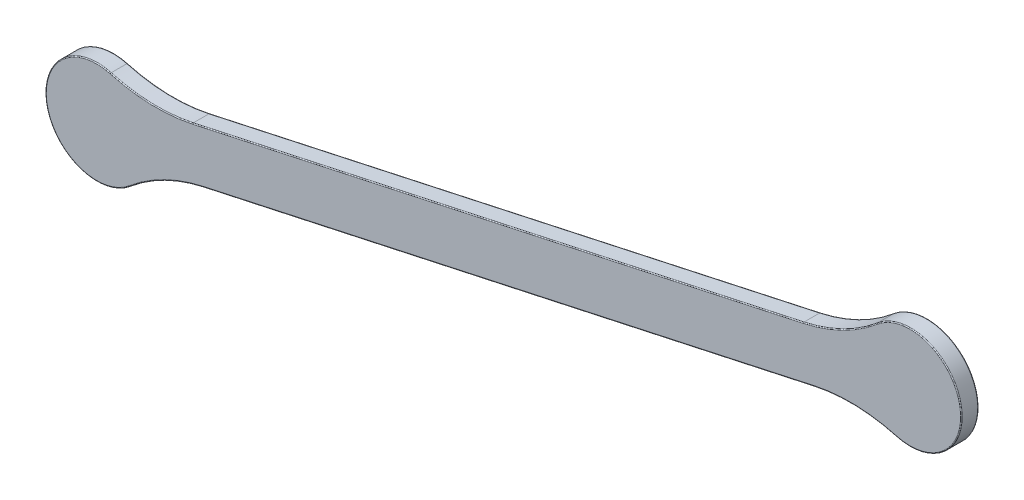
ISO-10303-21;
HEADER;
FILE_DESCRIPTION(('STEP AP214'),'2;1');
FILE_NAME('part.step','',(''),(''),'','','');
FILE_SCHEMA(('AUTOMOTIVE_DESIGN { 1 0 10303 214 1 1 1 1 }'));
ENDSEC;
DATA;
#1=APPLICATION_CONTEXT('core data for automotive mechanical design processes');
#2=APPLICATION_PROTOCOL_DEFINITION('international standard','automotive_design',2000,#1);
#3=PRODUCT_CONTEXT('',#1,'mechanical');
#4=PRODUCT('Part','Part','',(#3));
#5=PRODUCT_RELATED_PRODUCT_CATEGORY('part','',(#4));
#6=PRODUCT_DEFINITION_FORMATION('','',#4);
#7=PRODUCT_DEFINITION_CONTEXT('part definition',#1,'design');
#8=PRODUCT_DEFINITION('design','',#6,#7);
#9=PRODUCT_DEFINITION_SHAPE('','',#8);
#10=(LENGTH_UNIT() NAMED_UNIT(*) SI_UNIT(.MILLI.,.METRE.));
#11=(NAMED_UNIT(*) PLANE_ANGLE_UNIT() SI_UNIT($,.RADIAN.));
#12=(NAMED_UNIT(*) SI_UNIT($,.STERADIAN.) SOLID_ANGLE_UNIT());
#13=UNCERTAINTY_MEASURE_WITH_UNIT(LENGTH_MEASURE(1.E-05),#10,'distance_accuracy_value','');
#14=(GEOMETRIC_REPRESENTATION_CONTEXT(3) GLOBAL_UNCERTAINTY_ASSIGNED_CONTEXT((#13)) GLOBAL_UNIT_ASSIGNED_CONTEXT((#10,
#11,#12)) REPRESENTATION_CONTEXT('',''));
#15=CARTESIAN_POINT('',(0.,0.,0.));
#16=DIRECTION('',(0.,0.,1.));
#17=DIRECTION('',(1.,0.,0.));
#18=AXIS2_PLACEMENT_3D('',#15,#16,#17);
#19=CARTESIAN_POINT('',(-101.472478495042,222.230200700582,-3.));
#20=DIRECTION('',(0.,0.,1.));
#21=DIRECTION('',(1.,0.,0.));
#22=AXIS2_PLACEMENT_3D('',#19,#20,#21);
#23=CYLINDRICAL_SURFACE('',#22,9.);
#24=DIRECTION('',(0.,0.,1.));
#25=VECTOR('',#24,1.);
#26=CARTESIAN_POINT('',(-107.26569867696,229.117769206507,-3.));
#27=LINE('',#26,#25);
#28=CARTESIAN_POINT('',(-107.26569867696,229.117769206507,-2.85));
#29=VERTEX_POINT('',#28);
#30=CARTESIAN_POINT('',(-107.26569867696,229.117769206507,-0.15));
#31=VERTEX_POINT('',#30);
#32=EDGE_CURVE('E284',#29,#31,#27,.T.);
#33=ORIENTED_EDGE('',*,*,#32,.T.);
#34=CARTESIAN_POINT('',(-101.472478495042,222.230200700582,-0.15));
#35=DIRECTION('',(0.,0.,1.));
#36=DIRECTION('',(1.,0.,0.));
#37=AXIS2_PLACEMENT_3D('',#34,#35,#36);
#38=CIRCLE('',#37,9.);
#39=CARTESIAN_POINT('',(-103.881246361037,213.558532039491,-0.15));
#40=VERTEX_POINT('',#39);
#41=EDGE_CURVE('E201',#31,#40,#38,.F.);
#42=ORIENTED_EDGE('',*,*,#41,.T.);
#43=DIRECTION('',(0.,0.,1.));
#44=VECTOR('',#43,1.);
#45=CARTESIAN_POINT('',(-103.881246361037,213.558532039491,-3.));
#46=LINE('',#45,#44);
#47=CARTESIAN_POINT('',(-103.881246361037,213.558532039491,-2.85));
#48=VERTEX_POINT('',#47);
#49=EDGE_CURVE('E168',#40,#48,#46,.F.);
#50=ORIENTED_EDGE('',*,*,#49,.T.);
#51=CARTESIAN_POINT('',(-101.472478495042,222.230200700582,-2.85));
#52=DIRECTION('',(0.,0.,1.));
#53=DIRECTION('',(1.,0.,0.));
#54=AXIS2_PLACEMENT_3D('',#51,#52,#53);
#55=CIRCLE('',#54,9.);
#56=EDGE_CURVE('E199',#48,#29,#55,.T.);
#57=ORIENTED_EDGE('',*,*,#56,.T.);
#58=EDGE_LOOP('',(#33,#42,#50,#57));
#59=FACE_BOUND('',#58,.T.);
#60=ADVANCED_FACE('F35',(#59),#23,.T.);
#61=CARTESIAN_POINT('',(-49.7835516657889,228.868370737603,-3.));
#62=DIRECTION('',(-0.212550145444446,0.977150160247413,0.));
#63=DIRECTION('',(-0.977150160247413,-0.212550145444446,0.));
#64=AXIS2_PLACEMENT_3D('',#61,#62,#63);
#65=PLANE('',#64);
#66=DIRECTION('',(0.,0.,1.));
#67=VECTOR('',#66,1.);
#68=CARTESIAN_POINT('',(-118.286976944354,213.967474643276,-3.));
#69=LINE('',#68,#67);
#70=CARTESIAN_POINT('',(-118.286976944354,213.967474643276,-2.85));
#71=VERTEX_POINT('',#70);
#72=CARTESIAN_POINT('',(-118.286976944354,213.967474643276,-0.15));
#73=VERTEX_POINT('',#72);
#74=EDGE_CURVE('E285',#71,#73,#69,.T.);
#75=ORIENTED_EDGE('',*,*,#74,.T.);
#76=DIRECTION('',(-0.977150160247413,-0.212550145444446,0.));
#77=VECTOR('',#76,1.);
#78=CARTESIAN_POINT('',(-225.408952132852,190.666254080772,-0.15));
#79=LINE('',#78,#77);
#80=CARTESIAN_POINT('',(-225.408952132852,190.666254080772,-0.15));
#81=VERTEX_POINT('',#80);
#82=EDGE_CURVE('E209',#73,#81,#79,.T.);
#83=ORIENTED_EDGE('',*,*,#82,.T.);
#84=DIRECTION('',(0.,0.,1.));
#85=VECTOR('',#84,1.);
#86=CARTESIAN_POINT('',(-225.408952132852,190.666254080772,-3.));
#87=LINE('',#86,#85);
#88=CARTESIAN_POINT('',(-225.408952132852,190.666254080772,-2.85));
#89=VERTEX_POINT('',#88);
#90=EDGE_CURVE('E277',#81,#89,#87,.F.);
#91=ORIENTED_EDGE('',*,*,#90,.T.);
#92=DIRECTION('',(-0.977150160247413,-0.212550145444446,0.));
#93=VECTOR('',#92,1.);
#94=CARTESIAN_POINT('',(-49.7835516657889,228.868370737603,-2.85));
#95=LINE('',#94,#93);
#96=EDGE_CURVE('E207',#89,#71,#95,.F.);
#97=ORIENTED_EDGE('',*,*,#96,.T.);
#98=EDGE_LOOP('',(#75,#83,#91,#97));
#99=FACE_BOUND('',#98,.T.);
#100=ADVANCED_FACE('F282',(#99),#65,.F.);
#101=CARTESIAN_POINT('',(-244.136401891164,191.197879465693,-3.));
#102=DIRECTION('',(0.,0.,1.));
#103=DIRECTION('',(1.,0.,0.));
#104=AXIS2_PLACEMENT_3D('',#101,#102,#103);
#105=CYLINDRICAL_SURFACE('',#104,8.99999999999999);
#106=DIRECTION('',(0.,0.,1.));
#107=VECTOR('',#106,1.);
#108=CARTESIAN_POINT('',(-238.343181709246,184.310310959767,-3.));
#109=LINE('',#108,#107);
#110=CARTESIAN_POINT('',(-238.343181709246,184.310310959767,-2.85));
#111=VERTEX_POINT('',#110);
#112=CARTESIAN_POINT('',(-238.343181709246,184.310310959767,-0.15));
#113=VERTEX_POINT('',#112);
#114=EDGE_CURVE('E279',#111,#113,#109,.T.);
#115=ORIENTED_EDGE('',*,*,#114,.T.);
#116=CARTESIAN_POINT('',(-244.136401891164,191.197879465693,-0.15));
#117=DIRECTION('',(0.,0.,1.));
#118=DIRECTION('',(1.,0.,0.));
#119=AXIS2_PLACEMENT_3D('',#116,#117,#118);
#120=CIRCLE('',#119,8.99999999999999);
#121=CARTESIAN_POINT('',(-241.727634025169,199.869548126784,-0.15));
#122=VERTEX_POINT('',#121);
#123=EDGE_CURVE('E184',#113,#122,#120,.F.);
#124=ORIENTED_EDGE('',*,*,#123,.T.);
#125=DIRECTION('',(0.,0.,1.));
#126=VECTOR('',#125,1.);
#127=CARTESIAN_POINT('',(-241.727634025169,199.869548126784,-3.));
#128=LINE('',#127,#126);
#129=CARTESIAN_POINT('',(-241.727634025169,199.869548126784,-2.85));
#130=VERTEX_POINT('',#129);
#131=EDGE_CURVE('E289',#122,#130,#128,.F.);
#132=ORIENTED_EDGE('',*,*,#131,.T.);
#133=CARTESIAN_POINT('',(-244.136401891164,191.197879465693,-2.85));
#134=DIRECTION('',(0.,0.,1.));
#135=DIRECTION('',(1.,0.,0.));
#136=AXIS2_PLACEMENT_3D('',#133,#134,#135);
#137=CIRCLE('',#136,8.99999999999999);
#138=EDGE_CURVE('E182',#130,#111,#137,.T.);
#139=ORIENTED_EDGE('',*,*,#138,.T.);
#140=EDGE_LOOP('',(#115,#124,#132,#139));
#141=FACE_BOUND('',#140,.T.);
#142=ADVANCED_FACE('F314',(#141),#105,.T.);
#143=CARTESIAN_POINT('',(-51.6965029747889,237.66272217983,-3.));
#144=DIRECTION('',(-0.212550145444446,0.977150160247413,0.));
#145=DIRECTION('',(-0.977150160247413,-0.212550145444446,0.));
#146=AXIS2_PLACEMENT_3D('',#143,#144,#145);
#147=PLANE('',#146);
#148=DIRECTION('',(0.,0.,-1.));
#149=VECTOR('',#148,1.);
#150=CARTESIAN_POINT('',(-227.321903441852,199.460605522998,0.));
#151=LINE('',#150,#149);
#152=CARTESIAN_POINT('',(-227.321903441852,199.460605522998,-2.85));
#153=VERTEX_POINT('',#152);
#154=CARTESIAN_POINT('',(-227.321903441852,199.460605522998,-0.15));
#155=VERTEX_POINT('',#154);
#156=EDGE_CURVE('E315',#153,#155,#151,.F.);
#157=ORIENTED_EDGE('',*,*,#156,.T.);
#158=DIRECTION('',(-0.977150160247413,-0.212550145444446,0.));
#159=VECTOR('',#158,1.);
#160=CARTESIAN_POINT('',(-51.6965029747889,237.66272217983,-0.15));
#161=LINE('',#160,#159);
#162=CARTESIAN_POINT('',(-120.199928253354,222.761826085503,-0.15));
#163=VERTEX_POINT('',#162);
#164=EDGE_CURVE('E192',#155,#163,#161,.F.);
#165=ORIENTED_EDGE('',*,*,#164,.T.);
#166=DIRECTION('',(0.,0.,-1.));
#167=VECTOR('',#166,1.);
#168=CARTESIAN_POINT('',(-120.199928253354,222.761826085503,-3.));
#169=LINE('',#168,#167);
#170=CARTESIAN_POINT('',(-120.199928253354,222.761826085503,-2.85));
#171=VERTEX_POINT('',#170);
#172=EDGE_CURVE('E240',#163,#171,#169,.T.);
#173=ORIENTED_EDGE('',*,*,#172,.T.);
#174=DIRECTION('',(-0.977150160247413,-0.212550145444446,0.));
#175=VECTOR('',#174,1.);
#176=CARTESIAN_POINT('',(-227.321903441852,199.460605522998,-2.85));
#177=LINE('',#176,#175);
#178=EDGE_CURVE('E190',#171,#153,#177,.T.);
#179=ORIENTED_EDGE('',*,*,#178,.T.);
#180=EDGE_LOOP('',(#157,#165,#173,#179));
#181=FACE_BOUND('',#180,.T.);
#182=ADVANCED_FACE('F323',(#181),#147,.T.);
#183=CARTESIAN_POINT('',(0.,0.,-3.));
#184=DIRECTION('',(0.,0.,1.));
#185=DIRECTION('',(1.,0.,0.));
#186=AXIS2_PLACEMENT_3D('',#183,#184,#185);
#187=PLANE('',#186);
#188=DIRECTION('',(-0.977150160247413,-0.212550145444446,0.));
#189=VECTOR('',#188,1.);
#190=CARTESIAN_POINT('',(-120.168045731537,222.615253561466,-3.));
#191=LINE('',#190,#189);
#192=CARTESIAN_POINT('',(-227.290020920035,199.314032998961,-3.));
#193=VERTEX_POINT('',#192);
#194=CARTESIAN_POINT('',(-120.168045731537,222.615253561466,-3.));
#195=VERTEX_POINT('',#194);
#196=EDGE_CURVE('E44',#193,#195,#191,.F.);
#197=ORIENTED_EDGE('',*,*,#196,.T.);
#198=CARTESIAN_POINT('',(-126.576432616687,252.076330892925,-3.));
#199=DIRECTION('',(0.,0.,1.));
#200=DIRECTION('',(1.,0.,0.));
#201=AXIS2_PLACEMENT_3D('',#198,#199,#200);
#202=CIRCLE('',#201,30.15);
#203=CARTESIAN_POINT('',(-107.169145007261,229.002976398075,-3.));
#204=VERTEX_POINT('',#203);
#205=EDGE_CURVE('E11',#195,#204,#202,.T.);
#206=ORIENTED_EDGE('',*,*,#205,.T.);
#207=CARTESIAN_POINT('',(-101.472478495042,222.230200700582,-3.));
#208=DIRECTION('',(0.,0.,1.));
#209=DIRECTION('',(1.,0.,0.));
#210=AXIS2_PLACEMENT_3D('',#207,#208,#209);
#211=CIRCLE('',#210,8.85);
#212=CARTESIAN_POINT('',(-103.841100229937,213.703059850509,-3.));
#213=VERTEX_POINT('',#212);
#214=EDGE_CURVE('E211',#204,#213,#211,.F.);
#215=ORIENTED_EDGE('',*,*,#214,.T.);
#216=CARTESIAN_POINT('',(-111.91047258102,184.652969835854,-3.));
#217=DIRECTION('',(0.,0.,1.));
#218=DIRECTION('',(1.,0.,0.));
#219=AXIS2_PLACEMENT_3D('',#216,#217,#218);
#220=CIRCLE('',#219,30.15);
#221=CARTESIAN_POINT('',(-118.31885946617,214.114047167313,-3.));
#222=VERTEX_POINT('',#221);
#223=EDGE_CURVE('E213',#213,#222,#220,.T.);
#224=ORIENTED_EDGE('',*,*,#223,.T.);
#225=DIRECTION('',(-0.977150160247413,-0.212550145444446,0.));
#226=VECTOR('',#225,1.);
#227=CARTESIAN_POINT('',(-49.8154341876055,229.01494326164,-3.));
#228=LINE('',#227,#226);
#229=CARTESIAN_POINT('',(-225.440834654668,190.812826604809,-3.));
#230=VERTEX_POINT('',#229);
#231=EDGE_CURVE('E215',#222,#230,#228,.T.);
#232=ORIENTED_EDGE('',*,*,#231,.T.);
#233=CARTESIAN_POINT('',(-219.032447769518,161.351749273349,-3.));
#234=DIRECTION('',(0.,0.,1.));
#235=DIRECTION('',(1.,0.,0.));
#236=AXIS2_PLACEMENT_3D('',#233,#234,#235);
#237=CIRCLE('',#236,30.15);
#238=CARTESIAN_POINT('',(-238.439735378944,184.425103768199,-3.));
#239=VERTEX_POINT('',#238);
#240=EDGE_CURVE('E217',#230,#239,#237,.T.);
#241=ORIENTED_EDGE('',*,*,#240,.T.);
#242=CARTESIAN_POINT('',(-244.136401891164,191.197879465693,-3.));
#243=DIRECTION('',(0.,0.,1.));
#244=DIRECTION('',(1.,0.,0.));
#245=AXIS2_PLACEMENT_3D('',#242,#243,#244);
#246=CIRCLE('',#245,8.84999999999999);
#247=CARTESIAN_POINT('',(-241.767780156269,199.725020315765,-3.));
#248=VERTEX_POINT('',#247);
#249=EDGE_CURVE('E219',#239,#248,#246,.F.);
#250=ORIENTED_EDGE('',*,*,#249,.T.);
#251=CARTESIAN_POINT('',(-233.698407805185,228.775110330421,-3.));
#252=DIRECTION('',(0.,0.,1.));
#253=DIRECTION('',(1.,0.,0.));
#254=AXIS2_PLACEMENT_3D('',#251,#252,#253);
#255=CIRCLE('',#254,30.15);
#256=EDGE_CURVE('E55',#248,#193,#255,.T.);
#257=ORIENTED_EDGE('',*,*,#256,.T.);
#258=EDGE_LOOP('',(#197,#206,#215,#224,#232,#241,#250,#257));
#259=FACE_BOUND('',#258,.T.);
#260=ADVANCED_FACE('F527',(#259),#187,.F.);
#261=CARTESIAN_POINT('',(0.,0.,0.));
#262=DIRECTION('',(0.,0.,1.));
#263=DIRECTION('',(1.,0.,0.));
#264=AXIS2_PLACEMENT_3D('',#261,#262,#263);
#265=PLANE('',#264);
#266=CARTESIAN_POINT('',(-244.136401891164,191.197879465693,0.));
#267=DIRECTION('',(0.,0.,1.));
#268=DIRECTION('',(1.,0.,0.));
#269=AXIS2_PLACEMENT_3D('',#266,#267,#268);
#270=CIRCLE('',#269,8.84999999999999);
#271=CARTESIAN_POINT('',(-241.767780156269,199.725020315765,0.));
#272=VERTEX_POINT('',#271);
#273=CARTESIAN_POINT('',(-238.439735378944,184.425103768199,0.));
#274=VERTEX_POINT('',#273);
#275=EDGE_CURVE('E172',#272,#274,#270,.T.);
#276=ORIENTED_EDGE('',*,*,#275,.T.);
#277=CARTESIAN_POINT('',(-219.032447769518,161.351749273349,0.));
#278=DIRECTION('',(0.,0.,1.));
#279=DIRECTION('',(1.,0.,0.));
#280=AXIS2_PLACEMENT_3D('',#277,#278,#279);
#281=CIRCLE('',#280,30.15);
#282=CARTESIAN_POINT('',(-225.440834654668,190.812826604809,0.));
#283=VERTEX_POINT('',#282);
#284=EDGE_CURVE('E153',#274,#283,#281,.F.);
#285=ORIENTED_EDGE('',*,*,#284,.T.);
#286=DIRECTION('',(-0.977150160247413,-0.212550145444446,0.));
#287=VECTOR('',#286,1.);
#288=CARTESIAN_POINT('',(-118.31885946617,214.114047167313,0.));
#289=LINE('',#288,#287);
#290=CARTESIAN_POINT('',(-118.31885946617,214.114047167313,0.));
#291=VERTEX_POINT('',#290);
#292=EDGE_CURVE('E161',#283,#291,#289,.F.);
#293=ORIENTED_EDGE('',*,*,#292,.T.);
#294=CARTESIAN_POINT('',(-111.91047258102,184.652969835854,0.));
#295=DIRECTION('',(0.,0.,1.));
#296=DIRECTION('',(1.,0.,0.));
#297=AXIS2_PLACEMENT_3D('',#294,#295,#296);
#298=CIRCLE('',#297,30.15);
#299=CARTESIAN_POINT('',(-103.841100229937,213.703059850509,0.));
#300=VERTEX_POINT('',#299);
#301=EDGE_CURVE('E167',#291,#300,#298,.F.);
#302=ORIENTED_EDGE('',*,*,#301,.T.);
#303=CARTESIAN_POINT('',(-101.472478495042,222.230200700582,0.));
#304=DIRECTION('',(0.,0.,1.));
#305=DIRECTION('',(1.,0.,0.));
#306=AXIS2_PLACEMENT_3D('',#303,#304,#305);
#307=CIRCLE('',#306,8.85);
#308=CARTESIAN_POINT('',(-107.169145007261,229.002976398075,0.));
#309=VERTEX_POINT('',#308);
#310=EDGE_CURVE('E296',#300,#309,#307,.T.);
#311=ORIENTED_EDGE('',*,*,#310,.T.);
#312=CARTESIAN_POINT('',(-126.576432616687,252.076330892925,0.));
#313=DIRECTION('',(0.,0.,1.));
#314=DIRECTION('',(1.,0.,0.));
#315=AXIS2_PLACEMENT_3D('',#312,#313,#314);
#316=CIRCLE('',#315,30.15);
#317=CARTESIAN_POINT('',(-120.168045731537,222.615253561466,0.));
#318=VERTEX_POINT('',#317);
#319=EDGE_CURVE('E298',#309,#318,#316,.F.);
#320=ORIENTED_EDGE('',*,*,#319,.T.);
#321=DIRECTION('',(-0.977150160247413,-0.212550145444446,0.));
#322=VECTOR('',#321,1.);
#323=CARTESIAN_POINT('',(-51.6646204529722,237.516149655793,0.));
#324=LINE('',#323,#322);
#325=CARTESIAN_POINT('',(-227.290020920035,199.314032998961,0.));
#326=VERTEX_POINT('',#325);
#327=EDGE_CURVE('E300',#318,#326,#324,.T.);
#328=ORIENTED_EDGE('',*,*,#327,.T.);
#329=CARTESIAN_POINT('',(-233.698407805185,228.775110330421,0.));
#330=DIRECTION('',(0.,0.,1.));
#331=DIRECTION('',(1.,0.,0.));
#332=AXIS2_PLACEMENT_3D('',#329,#330,#331);
#333=CIRCLE('',#332,30.15);
#334=EDGE_CURVE('E177',#326,#272,#333,.F.);
#335=ORIENTED_EDGE('',*,*,#334,.T.);
#336=EDGE_LOOP('',(#276,#285,#293,#302,#311,#320,#328,#335));
#337=FACE_BOUND('',#336,.T.);
#338=ADVANCED_FACE('F170',(#337),#265,.T.);
#339=CARTESIAN_POINT('',(-233.698407805185,228.775110330421,-3.));
#340=DIRECTION('',(0.,0.,1.));
#341=DIRECTION('',(1.,0.,0.));
#342=AXIS2_PLACEMENT_3D('',#339,#340,#341);
#343=CYLINDRICAL_SURFACE('',#342,30.);
#344=ORIENTED_EDGE('',*,*,#131,.F.);
#345=CARTESIAN_POINT('',(-233.698407805185,228.775110330421,-0.15));
#346=DIRECTION('',(0.,0.,1.));
#347=DIRECTION('',(1.,0.,0.));
#348=AXIS2_PLACEMENT_3D('',#345,#346,#347);
#349=CIRCLE('',#348,30.);
#350=EDGE_CURVE('E188',#122,#155,#349,.T.);
#351=ORIENTED_EDGE('',*,*,#350,.T.);
#352=ORIENTED_EDGE('',*,*,#156,.F.);
#353=CARTESIAN_POINT('',(-233.698407805185,228.775110330421,-2.85));
#354=DIRECTION('',(0.,0.,1.));
#355=DIRECTION('',(1.,0.,0.));
#356=AXIS2_PLACEMENT_3D('',#353,#354,#355);
#357=CIRCLE('',#356,30.);
#358=EDGE_CURVE('E186',#153,#130,#357,.F.);
#359=ORIENTED_EDGE('',*,*,#358,.T.);
#360=EDGE_LOOP('',(#344,#351,#352,#359));
#361=FACE_BOUND('',#360,.T.);
#362=ADVANCED_FACE('F360',(#361),#343,.F.);
#363=CARTESIAN_POINT('',(-219.032447769518,161.351749273349,-3.));
#364=DIRECTION('',(0.,0.,1.));
#365=DIRECTION('',(1.,0.,0.));
#366=AXIS2_PLACEMENT_3D('',#363,#364,#365);
#367=CYLINDRICAL_SURFACE('',#366,30.);
#368=ORIENTED_EDGE('',*,*,#90,.F.);
#369=CARTESIAN_POINT('',(-219.032447769518,161.351749273349,-0.15));
#370=DIRECTION('',(0.,0.,1.));
#371=DIRECTION('',(1.,0.,0.));
#372=AXIS2_PLACEMENT_3D('',#369,#370,#371);
#373=CIRCLE('',#372,30.);
#374=EDGE_CURVE('E155',#81,#113,#373,.T.);
#375=ORIENTED_EDGE('',*,*,#374,.T.);
#376=ORIENTED_EDGE('',*,*,#114,.F.);
#377=CARTESIAN_POINT('',(-219.032447769518,161.351749273349,-2.85));
#378=DIRECTION('',(0.,0.,1.));
#379=DIRECTION('',(1.,0.,0.));
#380=AXIS2_PLACEMENT_3D('',#377,#378,#379);
#381=CIRCLE('',#380,30.);
#382=EDGE_CURVE('E174',#111,#89,#381,.F.);
#383=ORIENTED_EDGE('',*,*,#382,.T.);
#384=EDGE_LOOP('',(#368,#375,#376,#383));
#385=FACE_BOUND('',#384,.T.);
#386=ADVANCED_FACE('F276',(#385),#367,.F.);
#387=CARTESIAN_POINT('',(-111.91047258102,184.652969835854,-3.));
#388=DIRECTION('',(0.,0.,1.));
#389=DIRECTION('',(1.,0.,0.));
#390=AXIS2_PLACEMENT_3D('',#387,#388,#389);
#391=CYLINDRICAL_SURFACE('',#390,30.);
#392=ORIENTED_EDGE('',*,*,#49,.F.);
#393=CARTESIAN_POINT('',(-111.91047258102,184.652969835854,-0.15));
#394=DIRECTION('',(0.,0.,1.));
#395=DIRECTION('',(1.,0.,0.));
#396=AXIS2_PLACEMENT_3D('',#393,#394,#395);
#397=CIRCLE('',#396,30.);
#398=EDGE_CURVE('E205',#40,#73,#397,.T.);
#399=ORIENTED_EDGE('',*,*,#398,.T.);
#400=ORIENTED_EDGE('',*,*,#74,.F.);
#401=CARTESIAN_POINT('',(-111.91047258102,184.652969835854,-2.85));
#402=DIRECTION('',(0.,0.,1.));
#403=DIRECTION('',(1.,0.,0.));
#404=AXIS2_PLACEMENT_3D('',#401,#402,#403);
#405=CIRCLE('',#404,30.);
#406=EDGE_CURVE('E203',#71,#48,#405,.F.);
#407=ORIENTED_EDGE('',*,*,#406,.T.);
#408=EDGE_LOOP('',(#392,#399,#400,#407));
#409=FACE_BOUND('',#408,.T.);
#410=ADVANCED_FACE('F366',(#409),#391,.F.);
#411=CARTESIAN_POINT('',(-126.576432616687,252.076330892925,-3.));
#412=DIRECTION('',(0.,0.,1.));
#413=DIRECTION('',(1.,0.,0.));
#414=AXIS2_PLACEMENT_3D('',#411,#412,#413);
#415=CYLINDRICAL_SURFACE('',#414,30.);
#416=ORIENTED_EDGE('',*,*,#172,.F.);
#417=CARTESIAN_POINT('',(-126.576432616687,252.076330892925,-0.15));
#418=DIRECTION('',(0.,0.,1.));
#419=DIRECTION('',(1.,0.,0.));
#420=AXIS2_PLACEMENT_3D('',#417,#418,#419);
#421=CIRCLE('',#420,30.);
#422=EDGE_CURVE('E197',#163,#31,#421,.T.);
#423=ORIENTED_EDGE('',*,*,#422,.T.);
#424=ORIENTED_EDGE('',*,*,#32,.F.);
#425=CARTESIAN_POINT('',(-126.576432616687,252.076330892925,-2.85));
#426=DIRECTION('',(0.,0.,1.));
#427=DIRECTION('',(1.,0.,0.));
#428=AXIS2_PLACEMENT_3D('',#425,#426,#427);
#429=CIRCLE('',#428,30.);
#430=EDGE_CURVE('E194',#29,#171,#429,.F.);
#431=ORIENTED_EDGE('',*,*,#430,.T.);
#432=EDGE_LOOP('',(#416,#423,#424,#431));
#433=FACE_BOUND('',#432,.T.);
#434=ADVANCED_FACE('F329',(#433),#415,.F.);
#435=CARTESIAN_POINT('',(-126.576432616687,252.076330892925,-0.15));
#436=DIRECTION('',(0.,0.,1.));
#437=DIRECTION('',(1.,0.,0.));
#438=AXIS2_PLACEMENT_3D('',#435,#436,#437);
#439=TOROIDAL_SURFACE('',#438,30.15,0.15);
#440=CARTESIAN_POINT('',(-107.169145007261,229.002976398075,-0.15));
#441=DIRECTION('',(0.765285389547279,0.643691131324232,0.));
#442=DIRECTION('',(-0.643691131324232,0.765285389547279,0.));
#443=AXIS2_PLACEMENT_3D('',#440,#441,#442);
#444=CIRCLE('',#443,0.15);
#445=EDGE_CURVE('E234',#31,#309,#444,.T.);
#446=ORIENTED_EDGE('',*,*,#445,.F.);
#447=ORIENTED_EDGE('',*,*,#422,.F.);
#448=CARTESIAN_POINT('',(-120.168045731537,222.615253561466,-0.15));
#449=DIRECTION('',(-0.977150160247387,-0.212550145444568,0.));
#450=DIRECTION('',(0.212550145444568,-0.977150160247387,0.));
#451=AXIS2_PLACEMENT_3D('',#448,#449,#450);
#452=CIRCLE('',#451,0.15);
#453=EDGE_CURVE('E237',#318,#163,#452,.T.);
#454=ORIENTED_EDGE('',*,*,#453,.F.);
#455=ORIENTED_EDGE('',*,*,#319,.F.);
#456=EDGE_LOOP('',(#446,#447,#454,#455));
#457=FACE_BOUND('',#456,.T.);
#458=ADVANCED_FACE('F335',(#457),#439,.T.);
#459=CARTESIAN_POINT('',(-51.6646204529722,237.516149655793,-0.15));
#460=DIRECTION('',(-0.977150160247413,-0.212550145444446,0.));
#461=DIRECTION('',(0.212550145444446,-0.977150160247413,0.));
#462=AXIS2_PLACEMENT_3D('',#459,#460,#461);
#463=CYLINDRICAL_SURFACE('',#462,0.15);
#464=ORIENTED_EDGE('',*,*,#453,.T.);
#465=ORIENTED_EDGE('',*,*,#164,.F.);
#466=CARTESIAN_POINT('',(-227.290020920035,199.314032998961,-0.15));
#467=DIRECTION('',(-0.977150160247425,-0.212550145444391,0.));
#468=DIRECTION('',(0.212550145444391,-0.977150160247425,0.));
#469=AXIS2_PLACEMENT_3D('',#466,#467,#468);
#470=CIRCLE('',#469,0.15);
#471=EDGE_CURVE('E231',#326,#155,#470,.T.);
#472=ORIENTED_EDGE('',*,*,#471,.F.);
#473=ORIENTED_EDGE('',*,*,#327,.F.);
#474=EDGE_LOOP('',(#464,#465,#472,#473));
#475=FACE_BOUND('',#474,.T.);
#476=ADVANCED_FACE('F339',(#475),#463,.T.);
#477=CARTESIAN_POINT('',(-101.472478495042,222.230200700582,-0.15));
#478=DIRECTION('',(0.,0.,1.));
#479=DIRECTION('',(1.,0.,0.));
#480=AXIS2_PLACEMENT_3D('',#477,#478,#479);
#481=TOROIDAL_SURFACE('',#480,8.85,0.15);
#482=ORIENTED_EDGE('',*,*,#445,.T.);
#483=ORIENTED_EDGE('',*,*,#310,.F.);
#484=CARTESIAN_POINT('',(-103.841100229937,213.703059850509,-0.15));
#485=DIRECTION('',(-0.963518740121236,0.267640873999443,0.));
#486=DIRECTION('',(-0.267640873999443,-0.963518740121236,0.));
#487=AXIS2_PLACEMENT_3D('',#484,#485,#486);
#488=CIRCLE('',#487,0.15);
#489=EDGE_CURVE('E228',#40,#300,#488,.T.);
#490=ORIENTED_EDGE('',*,*,#489,.F.);
#491=ORIENTED_EDGE('',*,*,#41,.F.);
#492=EDGE_LOOP('',(#482,#483,#490,#491));
#493=FACE_BOUND('',#492,.T.);
#494=ADVANCED_FACE('F341',(#493),#481,.T.);
#495=CARTESIAN_POINT('',(-233.698407805185,228.775110330421,-0.15));
#496=DIRECTION('',(0.,0.,1.));
#497=DIRECTION('',(1.,0.,0.));
#498=AXIS2_PLACEMENT_3D('',#495,#496,#497);
#499=TOROIDAL_SURFACE('',#498,30.15,0.15);
#500=ORIENTED_EDGE('',*,*,#471,.T.);
#501=ORIENTED_EDGE('',*,*,#350,.F.);
#502=CARTESIAN_POINT('',(-241.767780156269,199.725020315765,-0.15));
#503=DIRECTION('',(-0.963518740121212,0.267640873999529,0.));
#504=DIRECTION('',(-0.267640873999529,-0.963518740121212,0.));
#505=AXIS2_PLACEMENT_3D('',#502,#503,#504);
#506=CIRCLE('',#505,0.15);
#507=EDGE_CURVE('E225',#272,#122,#506,.T.);
#508=ORIENTED_EDGE('',*,*,#507,.F.);
#509=ORIENTED_EDGE('',*,*,#334,.F.);
#510=EDGE_LOOP('',(#500,#501,#508,#509));
#511=FACE_BOUND('',#510,.T.);
#512=ADVANCED_FACE('F307',(#511),#499,.T.);
#513=CARTESIAN_POINT('',(-111.91047258102,184.652969835854,-0.15));
#514=DIRECTION('',(0.,0.,1.));
#515=DIRECTION('',(1.,0.,0.));
#516=AXIS2_PLACEMENT_3D('',#513,#514,#515);
#517=TOROIDAL_SURFACE('',#516,30.15,0.15);
#518=ORIENTED_EDGE('',*,*,#489,.T.);
#519=ORIENTED_EDGE('',*,*,#301,.F.);
#520=CARTESIAN_POINT('',(-118.31885946617,214.114047167313,-0.15));
#521=DIRECTION('',(-0.977150160247406,-0.212550145444479,0.));
#522=DIRECTION('',(0.212550145444479,-0.977150160247406,0.));
#523=AXIS2_PLACEMENT_3D('',#520,#521,#522);
#524=CIRCLE('',#523,0.15);
#525=EDGE_CURVE('E164',#73,#291,#524,.T.);
#526=ORIENTED_EDGE('',*,*,#525,.F.);
#527=ORIENTED_EDGE('',*,*,#398,.F.);
#528=EDGE_LOOP('',(#518,#519,#526,#527));
#529=FACE_BOUND('',#528,.T.);
#530=ADVANCED_FACE('F378',(#529),#517,.T.);
#531=CARTESIAN_POINT('',(-244.136401891164,191.197879465693,-0.15));
#532=DIRECTION('',(0.,0.,1.));
#533=DIRECTION('',(1.,0.,0.));
#534=AXIS2_PLACEMENT_3D('',#531,#532,#533);
#535=TOROIDAL_SURFACE('',#534,8.84999999999999,0.15);
#536=ORIENTED_EDGE('',*,*,#507,.T.);
#537=ORIENTED_EDGE('',*,*,#123,.F.);
#538=CARTESIAN_POINT('',(-238.439735378944,184.425103768199,-0.15));
#539=DIRECTION('',(0.765285389547324,0.643691131324178,0.));
#540=DIRECTION('',(-0.643691131324178,0.765285389547324,0.));
#541=AXIS2_PLACEMENT_3D('',#538,#539,#540);
#542=CIRCLE('',#541,0.15);
#543=EDGE_CURVE('E158',#274,#113,#542,.T.);
#544=ORIENTED_EDGE('',*,*,#543,.F.);
#545=ORIENTED_EDGE('',*,*,#275,.F.);
#546=EDGE_LOOP('',(#536,#537,#544,#545));
#547=FACE_BOUND('',#546,.T.);
#548=ADVANCED_FACE('F310',(#547),#535,.T.);
#549=CARTESIAN_POINT('',(-49.8154341876055,229.01494326164,-0.15));
#550=DIRECTION('',(0.977150160247413,0.212550145444446,0.));
#551=DIRECTION('',(-0.212550145444446,0.977150160247413,0.));
#552=AXIS2_PLACEMENT_3D('',#549,#550,#551);
#553=CYLINDRICAL_SURFACE('',#552,0.15);
#554=ORIENTED_EDGE('',*,*,#525,.T.);
#555=ORIENTED_EDGE('',*,*,#292,.F.);
#556=CARTESIAN_POINT('',(-225.440834654668,190.812826604809,-0.15));
#557=DIRECTION('',(-0.977150160247425,-0.212550145444391,0.));
#558=DIRECTION('',(0.212550145444391,-0.977150160247425,0.));
#559=AXIS2_PLACEMENT_3D('',#556,#557,#558);
#560=CIRCLE('',#559,0.15);
#561=EDGE_CURVE('E149',#81,#283,#560,.T.);
#562=ORIENTED_EDGE('',*,*,#561,.F.);
#563=ORIENTED_EDGE('',*,*,#82,.F.);
#564=EDGE_LOOP('',(#554,#555,#562,#563));
#565=FACE_BOUND('',#564,.T.);
#566=ADVANCED_FACE('F162',(#565),#553,.T.);
#567=CARTESIAN_POINT('',(-219.032447769518,161.351749273349,-0.15));
#568=DIRECTION('',(0.,0.,1.));
#569=DIRECTION('',(1.,0.,0.));
#570=AXIS2_PLACEMENT_3D('',#567,#568,#569);
#571=TOROIDAL_SURFACE('',#570,30.15,0.15);
#572=ORIENTED_EDGE('',*,*,#543,.T.);
#573=ORIENTED_EDGE('',*,*,#374,.F.);
#574=ORIENTED_EDGE('',*,*,#561,.T.);
#575=ORIENTED_EDGE('',*,*,#284,.F.);
#576=EDGE_LOOP('',(#572,#573,#574,#575));
#577=FACE_BOUND('',#576,.T.);
#578=ADVANCED_FACE('F151',(#577),#571,.T.);
#579=CARTESIAN_POINT('',(-219.032447769518,161.351749273349,-2.85));
#580=DIRECTION('',(0.,0.,1.));
#581=DIRECTION('',(1.,0.,0.));
#582=AXIS2_PLACEMENT_3D('',#579,#580,#581);
#583=TOROIDAL_SURFACE('',#582,30.15,0.15);
#584=CARTESIAN_POINT('',(-225.440834654668,190.812826604809,-2.85));
#585=DIRECTION('',(0.977150160247425,0.212550145444391,0.));
#586=DIRECTION('',(-0.212550145444391,0.977150160247425,0.));
#587=AXIS2_PLACEMENT_3D('',#584,#585,#586);
#588=CIRCLE('',#587,0.15);
#589=EDGE_CURVE('E256',#89,#230,#588,.T.);
#590=ORIENTED_EDGE('',*,*,#589,.F.);
#591=ORIENTED_EDGE('',*,*,#382,.F.);
#592=CARTESIAN_POINT('',(-238.439735378944,184.425103768199,-2.85));
#593=DIRECTION('',(-0.765285389547324,-0.643691131324178,0.));
#594=DIRECTION('',(0.643691131324178,-0.765285389547324,0.));
#595=AXIS2_PLACEMENT_3D('',#592,#593,#594);
#596=CIRCLE('',#595,0.15);
#597=EDGE_CURVE('E39',#239,#111,#596,.T.);
#598=ORIENTED_EDGE('',*,*,#597,.F.);
#599=ORIENTED_EDGE('',*,*,#240,.F.);
#600=EDGE_LOOP('',(#590,#591,#598,#599));
#601=FACE_BOUND('',#600,.T.);
#602=ADVANCED_FACE('F37',(#601),#583,.T.);
#603=CARTESIAN_POINT('',(-244.136401891164,191.197879465693,-2.85));
#604=DIRECTION('',(0.,0.,1.));
#605=DIRECTION('',(1.,0.,0.));
#606=AXIS2_PLACEMENT_3D('',#603,#604,#605);
#607=TOROIDAL_SURFACE('',#606,8.84999999999999,0.15);
#608=ORIENTED_EDGE('',*,*,#597,.T.);
#609=ORIENTED_EDGE('',*,*,#138,.F.);
#610=CARTESIAN_POINT('',(-241.767780156269,199.725020315765,-2.85));
#611=DIRECTION('',(0.963518740121225,-0.267640873999481,0.));
#612=DIRECTION('',(0.267640873999481,0.963518740121226,0.));
#613=AXIS2_PLACEMENT_3D('',#610,#611,#612);
#614=CIRCLE('',#613,0.15);
#615=EDGE_CURVE('E254',#248,#130,#614,.T.);
#616=ORIENTED_EDGE('',*,*,#615,.F.);
#617=ORIENTED_EDGE('',*,*,#249,.F.);
#618=EDGE_LOOP('',(#608,#609,#616,#617));
#619=FACE_BOUND('',#618,.T.);
#620=ADVANCED_FACE('F267',(#619),#607,.T.);
#621=CARTESIAN_POINT('',(-49.8154341876055,229.01494326164,-2.85));
#622=DIRECTION('',(-0.977150160247413,-0.212550145444446,0.));
#623=DIRECTION('',(0.212550145444446,-0.977150160247413,0.));
#624=AXIS2_PLACEMENT_3D('',#621,#622,#623);
#625=CYLINDRICAL_SURFACE('',#624,0.15);
#626=ORIENTED_EDGE('',*,*,#589,.T.);
#627=ORIENTED_EDGE('',*,*,#231,.F.);
#628=CARTESIAN_POINT('',(-118.31885946617,214.114047167313,-2.85));
#629=DIRECTION('',(0.977150160247406,0.212550145444479,0.));
#630=DIRECTION('',(-0.212550145444479,0.977150160247406,0.));
#631=AXIS2_PLACEMENT_3D('',#628,#629,#630);
#632=CIRCLE('',#631,0.15);
#633=EDGE_CURVE('E251',#71,#222,#632,.T.);
#634=ORIENTED_EDGE('',*,*,#633,.F.);
#635=ORIENTED_EDGE('',*,*,#96,.F.);
#636=EDGE_LOOP('',(#626,#627,#634,#635));
#637=FACE_BOUND('',#636,.T.);
#638=ADVANCED_FACE('F414',(#637),#625,.T.);
#639=CARTESIAN_POINT('',(-233.698407805185,228.775110330421,-2.85));
#640=DIRECTION('',(0.,0.,1.));
#641=DIRECTION('',(1.,0.,0.));
#642=AXIS2_PLACEMENT_3D('',#639,#640,#641);
#643=TOROIDAL_SURFACE('',#642,30.15,0.15);
#644=ORIENTED_EDGE('',*,*,#615,.T.);
#645=ORIENTED_EDGE('',*,*,#358,.F.);
#646=CARTESIAN_POINT('',(-227.290020920035,199.314032998961,-2.85));
#647=DIRECTION('',(0.977150160247425,0.212550145444391,0.));
#648=DIRECTION('',(-0.212550145444391,0.977150160247425,0.));
#649=AXIS2_PLACEMENT_3D('',#646,#647,#648);
#650=CIRCLE('',#649,0.15);
#651=EDGE_CURVE('E248',#193,#153,#650,.T.);
#652=ORIENTED_EDGE('',*,*,#651,.F.);
#653=ORIENTED_EDGE('',*,*,#256,.F.);
#654=EDGE_LOOP('',(#644,#645,#652,#653));
#655=FACE_BOUND('',#654,.T.);
#656=ADVANCED_FACE('F420',(#655),#643,.T.);
#657=CARTESIAN_POINT('',(-111.91047258102,184.652969835854,-2.85));
#658=DIRECTION('',(0.,0.,1.));
#659=DIRECTION('',(1.,0.,0.));
#660=AXIS2_PLACEMENT_3D('',#657,#658,#659);
#661=TOROIDAL_SURFACE('',#660,30.15,0.15);
#662=ORIENTED_EDGE('',*,*,#633,.T.);
#663=ORIENTED_EDGE('',*,*,#223,.F.);
#664=CARTESIAN_POINT('',(-103.841100229937,213.703059850509,-2.85));
#665=DIRECTION('',(0.963518740121236,-0.267640873999443,0.));
#666=DIRECTION('',(0.267640873999443,0.963518740121236,0.));
#667=AXIS2_PLACEMENT_3D('',#664,#665,#666);
#668=CIRCLE('',#667,0.15);
#669=EDGE_CURVE('E245',#48,#213,#668,.T.);
#670=ORIENTED_EDGE('',*,*,#669,.F.);
#671=ORIENTED_EDGE('',*,*,#406,.F.);
#672=EDGE_LOOP('',(#662,#663,#670,#671));
#673=FACE_BOUND('',#672,.T.);
#674=ADVANCED_FACE('F427',(#673),#661,.T.);
#675=CARTESIAN_POINT('',(-51.6646204529722,237.516149655793,-2.85));
#676=DIRECTION('',(0.977150160247413,0.212550145444446,0.));
#677=DIRECTION('',(-0.212550145444446,0.977150160247413,0.));
#678=AXIS2_PLACEMENT_3D('',#675,#676,#677);
#679=CYLINDRICAL_SURFACE('',#678,0.15);
#680=ORIENTED_EDGE('',*,*,#651,.T.);
#681=ORIENTED_EDGE('',*,*,#178,.F.);
#682=CARTESIAN_POINT('',(-120.168045731537,222.615253561466,-2.85));
#683=DIRECTION('',(0.977150160247406,0.212550145444479,0.));
#684=DIRECTION('',(-0.212550145444479,0.977150160247406,0.));
#685=AXIS2_PLACEMENT_3D('',#682,#683,#684);
#686=CIRCLE('',#685,0.15);
#687=EDGE_CURVE('E243',#195,#171,#686,.T.);
#688=ORIENTED_EDGE('',*,*,#687,.F.);
#689=ORIENTED_EDGE('',*,*,#196,.F.);
#690=EDGE_LOOP('',(#680,#681,#688,#689));
#691=FACE_BOUND('',#690,.T.);
#692=ADVANCED_FACE('F435',(#691),#679,.T.);
#693=CARTESIAN_POINT('',(-101.472478495042,222.230200700582,-2.85));
#694=DIRECTION('',(0.,0.,1.));
#695=DIRECTION('',(1.,0.,0.));
#696=AXIS2_PLACEMENT_3D('',#693,#694,#695);
#697=TOROIDAL_SURFACE('',#696,8.85,0.15);
#698=ORIENTED_EDGE('',*,*,#669,.T.);
#699=ORIENTED_EDGE('',*,*,#214,.F.);
#700=CARTESIAN_POINT('',(-107.169145007261,229.002976398075,-2.85));
#701=DIRECTION('',(-0.765285389547279,-0.643691131324232,0.));
#702=DIRECTION('',(0.643691131324232,-0.765285389547279,0.));
#703=AXIS2_PLACEMENT_3D('',#700,#701,#702);
#704=CIRCLE('',#703,0.15);
#705=EDGE_CURVE('E241',#29,#204,#704,.T.);
#706=ORIENTED_EDGE('',*,*,#705,.F.);
#707=ORIENTED_EDGE('',*,*,#56,.F.);
#708=EDGE_LOOP('',(#698,#699,#706,#707));
#709=FACE_BOUND('',#708,.T.);
#710=ADVANCED_FACE('F443',(#709),#697,.T.);
#711=CARTESIAN_POINT('',(-126.576432616687,252.076330892925,-2.85));
#712=DIRECTION('',(0.,0.,1.));
#713=DIRECTION('',(1.,0.,0.));
#714=AXIS2_PLACEMENT_3D('',#711,#712,#713);
#715=TOROIDAL_SURFACE('',#714,30.15,0.15);
#716=ORIENTED_EDGE('',*,*,#687,.T.);
#717=ORIENTED_EDGE('',*,*,#430,.F.);
#718=ORIENTED_EDGE('',*,*,#705,.T.);
#719=ORIENTED_EDGE('',*,*,#205,.F.);
#720=EDGE_LOOP('',(#716,#717,#718,#719));
#721=FACE_BOUND('',#720,.T.);
#722=ADVANCED_FACE('F451',(#721),#715,.T.);
#723=CLOSED_SHELL('',(#60,#100,#142,#182,#260,#338,#362,#386,#410,#434,#458,#476,#494,#512,#530,
#548,#566,#578,#602,#620,#638,#656,#674,#692,#710,#722));
#724=MANIFOLD_SOLID_BREP('B2',#723);
#725=ADVANCED_BREP_SHAPE_REPRESENTATION('',(#18,#724),#14);
#726=SHAPE_DEFINITION_REPRESENTATION(#9,#725);
ENDSEC;
END-ISO-10303-21;
